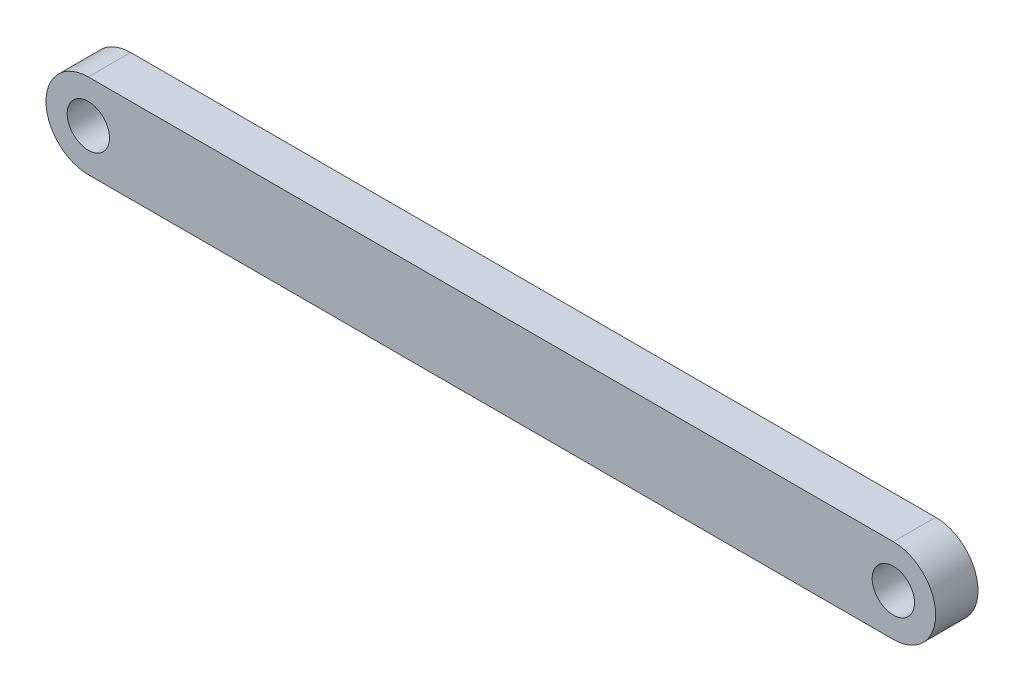
ISO-10303-21;
HEADER;
FILE_DESCRIPTION(('STEP AP214'),'2;1');
FILE_NAME('part.step','',(''),(''),'','','');
FILE_SCHEMA(('AUTOMOTIVE_DESIGN { 1 0 10303 214 1 1 1 1 }'));
ENDSEC;
DATA;
#1=APPLICATION_CONTEXT('core data for automotive mechanical design processes');
#2=APPLICATION_PROTOCOL_DEFINITION('international standard','automotive_design',2000,#1);
#3=PRODUCT_CONTEXT('',#1,'mechanical');
#4=PRODUCT('Part','Part','',(#3));
#5=PRODUCT_RELATED_PRODUCT_CATEGORY('part','',(#4));
#6=PRODUCT_DEFINITION_FORMATION('','',#4);
#7=PRODUCT_DEFINITION_CONTEXT('part definition',#1,'design');
#8=PRODUCT_DEFINITION('design','',#6,#7);
#9=PRODUCT_DEFINITION_SHAPE('','',#8);
#10=(LENGTH_UNIT() NAMED_UNIT(*) SI_UNIT(.MILLI.,.METRE.));
#11=(NAMED_UNIT(*) PLANE_ANGLE_UNIT() SI_UNIT($,.RADIAN.));
#12=(NAMED_UNIT(*) SI_UNIT($,.STERADIAN.) SOLID_ANGLE_UNIT());
#13=UNCERTAINTY_MEASURE_WITH_UNIT(LENGTH_MEASURE(1.E-05),#10,'distance_accuracy_value','');
#14=(GEOMETRIC_REPRESENTATION_CONTEXT(3) GLOBAL_UNCERTAINTY_ASSIGNED_CONTEXT((#13)) GLOBAL_UNIT_ASSIGNED_CONTEXT((#10,
#11,#12)) REPRESENTATION_CONTEXT('',''));
#15=CARTESIAN_POINT('',(0.,0.,0.));
#16=DIRECTION('',(0.,0.,1.));
#17=DIRECTION('',(1.,0.,0.));
#18=AXIS2_PLACEMENT_3D('',#15,#16,#17);
#19=CARTESIAN_POINT('',(49.49,15.947444659623,5.));
#20=DIRECTION('',(0.,0.,-1.));
#21=DIRECTION('',(-1.,0.,0.));
#22=AXIS2_PLACEMENT_3D('',#19,#20,#21);
#23=PLANE('',#22);
#24=CARTESIAN_POINT('',(49.49,15.947444659623,5.));
#25=DIRECTION('',(0.,0.,1.));
#26=DIRECTION('',(-1.,0.,0.));
#27=AXIS2_PLACEMENT_3D('',#24,#25,#26);
#28=CIRCLE('',#27,5.);
#29=CARTESIAN_POINT('',(49.49,10.947444659623,5.));
#30=VERTEX_POINT('',#29);
#31=CARTESIAN_POINT('',(49.49,20.947444659623,5.));
#32=VERTEX_POINT('',#31);
#33=EDGE_CURVE('E90',#30,#32,#28,.T.);
#34=ORIENTED_EDGE('',*,*,#33,.T.);
#35=DIRECTION('',(-1.,0.,0.));
#36=VECTOR('',#35,1.);
#37=CARTESIAN_POINT('',(-45.57,20.947444659623,5.));
#38=LINE('',#37,#36);
#39=CARTESIAN_POINT('',(-45.57,20.947444659623,5.));
#40=VERTEX_POINT('',#39);
#41=EDGE_CURVE('E85',#32,#40,#38,.T.);
#42=ORIENTED_EDGE('',*,*,#41,.T.);
#43=CARTESIAN_POINT('',(-45.57,15.947444659623,5.));
#44=DIRECTION('',(0.,0.,1.));
#45=DIRECTION('',(1.,0.,0.));
#46=AXIS2_PLACEMENT_3D('',#43,#44,#45);
#47=CIRCLE('',#46,5.);
#48=CARTESIAN_POINT('',(-45.57,10.947444659623,5.));
#49=VERTEX_POINT('',#48);
#50=EDGE_CURVE('E88',#40,#49,#47,.T.);
#51=ORIENTED_EDGE('',*,*,#50,.T.);
#52=DIRECTION('',(1.,0.,0.));
#53=VECTOR('',#52,1.);
#54=CARTESIAN_POINT('',(-45.57,10.947444659623,5.));
#55=LINE('',#54,#53);
#56=EDGE_CURVE('E55',#49,#30,#55,.T.);
#57=ORIENTED_EDGE('',*,*,#56,.T.);
#58=EDGE_LOOP('',(#34,#42,#51,#57));
#59=FACE_BOUND('',#58,.T.);
#60=CARTESIAN_POINT('',(-45.57,15.947444659623,5.));
#61=DIRECTION('',(0.,0.,1.));
#62=DIRECTION('',(1.,0.,0.));
#63=AXIS2_PLACEMENT_3D('',#60,#61,#62);
#64=CIRCLE('',#63,2.5);
#65=CARTESIAN_POINT('',(-43.07,15.947444659623,5.));
#66=VERTEX_POINT('',#65);
#67=EDGE_CURVE('E105',#66,#66,#64,.T.);
#68=ORIENTED_EDGE('',*,*,#67,.F.);
#69=EDGE_LOOP('',(#68));
#70=FACE_BOUND('',#69,.T.);
#71=CARTESIAN_POINT('',(49.49,15.947444659623,5.));
#72=DIRECTION('',(0.,0.,1.));
#73=DIRECTION('',(1.,0.,0.));
#74=AXIS2_PLACEMENT_3D('',#71,#72,#73);
#75=CIRCLE('',#74,2.5);
#76=CARTESIAN_POINT('',(51.99,15.947444659623,5.));
#77=VERTEX_POINT('',#76);
#78=EDGE_CURVE('E120',#77,#77,#75,.T.);
#79=ORIENTED_EDGE('',*,*,#78,.F.);
#80=EDGE_LOOP('',(#79));
#81=FACE_BOUND('',#80,.T.);
#82=ADVANCED_FACE('F38',(#59,#70,#81),#23,.F.);
#83=CARTESIAN_POINT('',(49.49,15.947444659623,0.));
#84=DIRECTION('',(0.,0.,-1.));
#85=DIRECTION('',(-1.,0.,0.));
#86=AXIS2_PLACEMENT_3D('',#83,#84,#85);
#87=PLANE('',#86);
#88=CARTESIAN_POINT('',(-45.57,15.947444659623,0.));
#89=DIRECTION('',(0.,0.,1.));
#90=DIRECTION('',(1.,0.,0.));
#91=AXIS2_PLACEMENT_3D('',#88,#89,#90);
#92=CIRCLE('',#91,2.5);
#93=CARTESIAN_POINT('',(-43.07,15.947444659623,0.));
#94=VERTEX_POINT('',#93);
#95=EDGE_CURVE('E117',#94,#94,#92,.T.);
#96=ORIENTED_EDGE('',*,*,#95,.T.);
#97=EDGE_LOOP('',(#96));
#98=FACE_BOUND('',#97,.T.);
#99=CARTESIAN_POINT('',(49.49,15.947444659623,0.));
#100=DIRECTION('',(0.,0.,1.));
#101=DIRECTION('',(-1.,0.,0.));
#102=AXIS2_PLACEMENT_3D('',#99,#100,#101);
#103=CIRCLE('',#102,5.);
#104=CARTESIAN_POINT('',(49.49,10.947444659623,0.));
#105=VERTEX_POINT('',#104);
#106=CARTESIAN_POINT('',(49.49,20.947444659623,0.));
#107=VERTEX_POINT('',#106);
#108=EDGE_CURVE('E102',#105,#107,#103,.T.);
#109=ORIENTED_EDGE('',*,*,#108,.F.);
#110=DIRECTION('',(1.,0.,0.));
#111=VECTOR('',#110,1.);
#112=CARTESIAN_POINT('',(-45.57,10.947444659623,0.));
#113=LINE('',#112,#111);
#114=CARTESIAN_POINT('',(-45.57,10.947444659623,0.));
#115=VERTEX_POINT('',#114);
#116=EDGE_CURVE('E78',#115,#105,#113,.T.);
#117=ORIENTED_EDGE('',*,*,#116,.F.);
#118=CARTESIAN_POINT('',(-45.57,15.947444659623,0.));
#119=DIRECTION('',(0.,0.,1.));
#120=DIRECTION('',(1.,0.,0.));
#121=AXIS2_PLACEMENT_3D('',#118,#119,#120);
#122=CIRCLE('',#121,5.);
#123=CARTESIAN_POINT('',(-45.57,20.947444659623,0.));
#124=VERTEX_POINT('',#123);
#125=EDGE_CURVE('E72',#124,#115,#122,.T.);
#126=ORIENTED_EDGE('',*,*,#125,.F.);
#127=DIRECTION('',(-1.,0.,0.));
#128=VECTOR('',#127,1.);
#129=CARTESIAN_POINT('',(-45.57,20.947444659623,0.));
#130=LINE('',#129,#128);
#131=EDGE_CURVE('E94',#107,#124,#130,.T.);
#132=ORIENTED_EDGE('',*,*,#131,.F.);
#133=EDGE_LOOP('',(#109,#117,#126,#132));
#134=FACE_BOUND('',#133,.T.);
#135=CARTESIAN_POINT('',(49.49,15.947444659623,0.));
#136=DIRECTION('',(0.,0.,1.));
#137=DIRECTION('',(1.,0.,0.));
#138=AXIS2_PLACEMENT_3D('',#135,#136,#137);
#139=CIRCLE('',#138,2.5);
#140=CARTESIAN_POINT('',(51.99,15.947444659623,0.));
#141=VERTEX_POINT('',#140);
#142=EDGE_CURVE('E123',#141,#141,#139,.T.);
#143=ORIENTED_EDGE('',*,*,#142,.T.);
#144=EDGE_LOOP('',(#143));
#145=FACE_BOUND('',#144,.T.);
#146=ADVANCED_FACE('F113',(#98,#134,#145),#87,.T.);
#147=CARTESIAN_POINT('',(49.49,15.947444659623,5.));
#148=DIRECTION('',(0.,0.,-1.));
#149=DIRECTION('',(-1.,0.,0.));
#150=AXIS2_PLACEMENT_3D('',#147,#148,#149);
#151=CYLINDRICAL_SURFACE('',#150,5.);
#152=ORIENTED_EDGE('',*,*,#108,.T.);
#153=DIRECTION('',(0.,0.,-1.));
#154=VECTOR('',#153,1.);
#155=CARTESIAN_POINT('',(49.49,20.947444659623,5.));
#156=LINE('',#155,#154);
#157=EDGE_CURVE('E11',#32,#107,#156,.T.);
#158=ORIENTED_EDGE('',*,*,#157,.F.);
#159=ORIENTED_EDGE('',*,*,#33,.F.);
#160=DIRECTION('',(0.,0.,-1.));
#161=VECTOR('',#160,1.);
#162=CARTESIAN_POINT('',(49.49,10.947444659623,5.));
#163=LINE('',#162,#161);
#164=EDGE_CURVE('E98',#30,#105,#163,.T.);
#165=ORIENTED_EDGE('',*,*,#164,.T.);
#166=EDGE_LOOP('',(#152,#158,#159,#165));
#167=FACE_BOUND('',#166,.T.);
#168=ADVANCED_FACE('F40',(#167),#151,.T.);
#169=CARTESIAN_POINT('',(-45.57,20.947444659623,5.));
#170=DIRECTION('',(0.,-1.,0.));
#171=DIRECTION('',(0.,0.,-1.));
#172=AXIS2_PLACEMENT_3D('',#169,#170,#171);
#173=PLANE('',#172);
#174=ORIENTED_EDGE('',*,*,#131,.T.);
#175=DIRECTION('',(0.,0.,-1.));
#176=VECTOR('',#175,1.);
#177=CARTESIAN_POINT('',(-45.57,20.947444659623,5.));
#178=LINE('',#177,#176);
#179=EDGE_CURVE('E47',#40,#124,#178,.T.);
#180=ORIENTED_EDGE('',*,*,#179,.F.);
#181=ORIENTED_EDGE('',*,*,#41,.F.);
#182=ORIENTED_EDGE('',*,*,#157,.T.);
#183=EDGE_LOOP('',(#174,#180,#181,#182));
#184=FACE_BOUND('',#183,.T.);
#185=ADVANCED_FACE('F93',(#184),#173,.F.);
#186=CARTESIAN_POINT('',(-45.57,15.947444659623,5.));
#187=DIRECTION('',(0.,0.,-1.));
#188=DIRECTION('',(-1.,0.,0.));
#189=AXIS2_PLACEMENT_3D('',#186,#187,#188);
#190=CYLINDRICAL_SURFACE('',#189,5.);
#191=ORIENTED_EDGE('',*,*,#125,.T.);
#192=DIRECTION('',(0.,0.,-1.));
#193=VECTOR('',#192,1.);
#194=CARTESIAN_POINT('',(-45.57,10.947444659623,5.));
#195=LINE('',#194,#193);
#196=EDGE_CURVE('E95',#49,#115,#195,.T.);
#197=ORIENTED_EDGE('',*,*,#196,.F.);
#198=ORIENTED_EDGE('',*,*,#50,.F.);
#199=ORIENTED_EDGE('',*,*,#179,.T.);
#200=EDGE_LOOP('',(#191,#197,#198,#199));
#201=FACE_BOUND('',#200,.T.);
#202=ADVANCED_FACE('F96',(#201),#190,.T.);
#203=CARTESIAN_POINT('',(-45.57,10.947444659623,5.));
#204=DIRECTION('',(0.,1.,0.));
#205=DIRECTION('',(0.,0.,1.));
#206=AXIS2_PLACEMENT_3D('',#203,#204,#205);
#207=PLANE('',#206);
#208=ORIENTED_EDGE('',*,*,#116,.T.);
#209=ORIENTED_EDGE('',*,*,#164,.F.);
#210=ORIENTED_EDGE('',*,*,#56,.F.);
#211=ORIENTED_EDGE('',*,*,#196,.T.);
#212=EDGE_LOOP('',(#208,#209,#210,#211));
#213=FACE_BOUND('',#212,.T.);
#214=ADVANCED_FACE('F110',(#213),#207,.F.);
#215=CARTESIAN_POINT('',(-45.57,15.947444659623,5.));
#216=DIRECTION('',(0.,0.,-1.));
#217=DIRECTION('',(-1.,0.,0.));
#218=AXIS2_PLACEMENT_3D('',#215,#216,#217);
#219=CYLINDRICAL_SURFACE('',#218,2.5);
#220=ORIENTED_EDGE('',*,*,#67,.T.);
#221=EDGE_LOOP('',(#220));
#222=FACE_BOUND('',#221,.T.);
#223=ORIENTED_EDGE('',*,*,#95,.F.);
#224=EDGE_LOOP('',(#223));
#225=FACE_BOUND('',#224,.T.);
#226=ADVANCED_FACE('F140',(#222,#225),#219,.F.);
#227=CARTESIAN_POINT('',(49.49,15.947444659623,5.));
#228=DIRECTION('',(0.,0.,-1.));
#229=DIRECTION('',(-1.,0.,0.));
#230=AXIS2_PLACEMENT_3D('',#227,#228,#229);
#231=CYLINDRICAL_SURFACE('',#230,2.5);
#232=ORIENTED_EDGE('',*,*,#78,.T.);
#233=EDGE_LOOP('',(#232));
#234=FACE_BOUND('',#233,.T.);
#235=ORIENTED_EDGE('',*,*,#142,.F.);
#236=EDGE_LOOP('',(#235));
#237=FACE_BOUND('',#236,.T.);
#238=ADVANCED_FACE('F129',(#234,#237),#231,.F.);
#239=CLOSED_SHELL('',(#82,#146,#168,#185,#202,#214,#226,#238));
#240=MANIFOLD_SOLID_BREP('B2',#239);
#241=ADVANCED_BREP_SHAPE_REPRESENTATION('',(#18,#240),#14);
#242=SHAPE_DEFINITION_REPRESENTATION(#9,#241);
ENDSEC;
END-ISO-10303-21;
